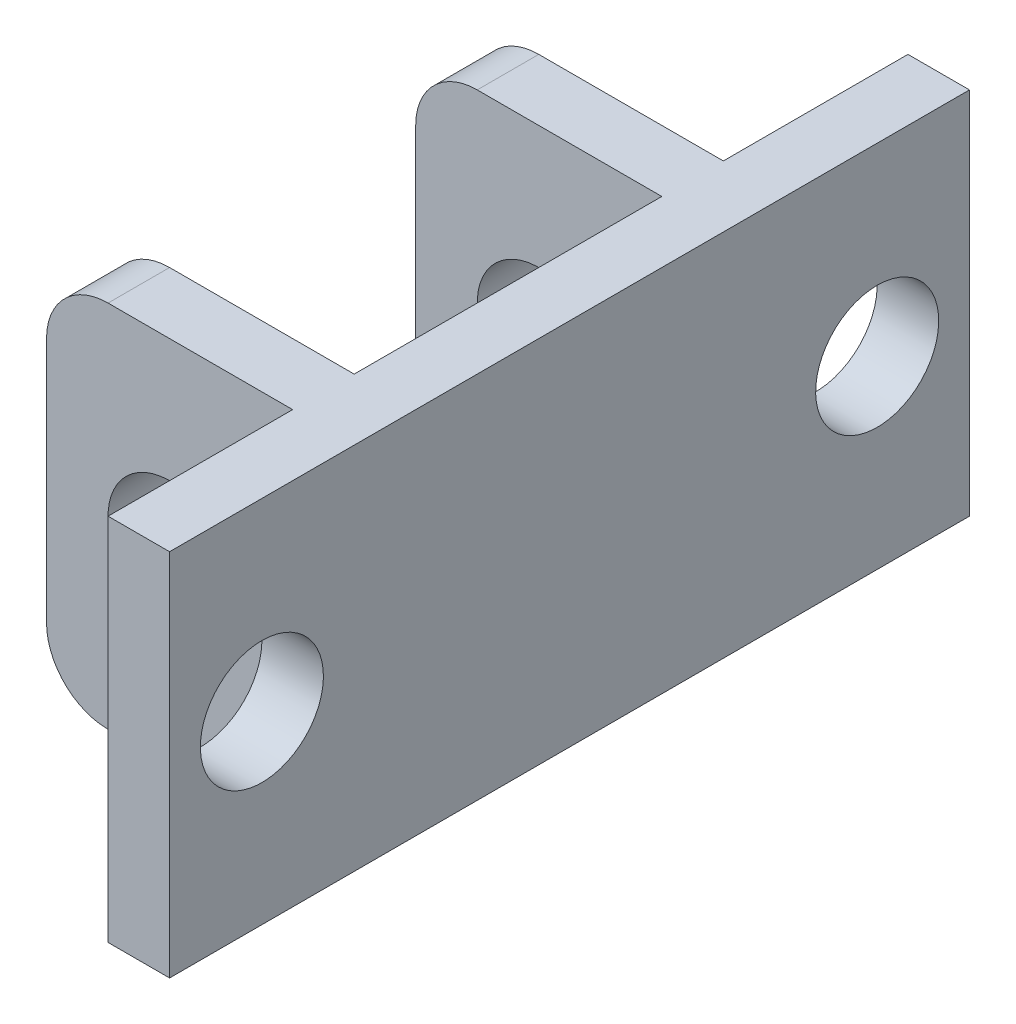
ISO-10303-21;
HEADER;
FILE_DESCRIPTION(('STEP AP214'),'2;1');
FILE_NAME('part.step','',(''),(''),'','','');
FILE_SCHEMA(('AUTOMOTIVE_DESIGN { 1 0 10303 214 1 1 1 1 }'));
ENDSEC;
DATA;
#1=APPLICATION_CONTEXT('core data for automotive mechanical design processes');
#2=APPLICATION_PROTOCOL_DEFINITION('international standard','automotive_design',2000,#1);
#3=PRODUCT_CONTEXT('',#1,'mechanical');
#4=PRODUCT('Part','Part','',(#3));
#5=PRODUCT_RELATED_PRODUCT_CATEGORY('part','',(#4));
#6=PRODUCT_DEFINITION_FORMATION('','',#4);
#7=PRODUCT_DEFINITION_CONTEXT('part definition',#1,'design');
#8=PRODUCT_DEFINITION('design','',#6,#7);
#9=PRODUCT_DEFINITION_SHAPE('','',#8);
#10=(LENGTH_UNIT() NAMED_UNIT(*) SI_UNIT(.MILLI.,.METRE.));
#11=(NAMED_UNIT(*) PLANE_ANGLE_UNIT() SI_UNIT($,.RADIAN.));
#12=(NAMED_UNIT(*) SI_UNIT($,.STERADIAN.) SOLID_ANGLE_UNIT());
#13=UNCERTAINTY_MEASURE_WITH_UNIT(LENGTH_MEASURE(1.E-05),#10,'distance_accuracy_value','');
#14=(GEOMETRIC_REPRESENTATION_CONTEXT(3) GLOBAL_UNCERTAINTY_ASSIGNED_CONTEXT((#13)) GLOBAL_UNIT_ASSIGNED_CONTEXT((#10,
#11,#12)) REPRESENTATION_CONTEXT('',''));
#15=CARTESIAN_POINT('',(0.,0.,0.));
#16=DIRECTION('',(0.,0.,1.));
#17=DIRECTION('',(1.,0.,0.));
#18=AXIS2_PLACEMENT_3D('',#15,#16,#17);
#19=CARTESIAN_POINT('',(0.,0.,1.));
#20=DIRECTION('',(0.,0.,1.));
#21=DIRECTION('',(1.,0.,0.));
#22=AXIS2_PLACEMENT_3D('',#19,#20,#21);
#23=PLANE('',#22);
#24=DIRECTION('',(0.,-1.,0.));
#25=VECTOR('',#24,1.);
#26=CARTESIAN_POINT('',(-2.,3.,1.));
#27=LINE('',#26,#25);
#28=CARTESIAN_POINT('',(-2.,2.,1.));
#29=VERTEX_POINT('',#28);
#30=CARTESIAN_POINT('',(-2.,-2.,1.));
#31=VERTEX_POINT('',#30);
#32=EDGE_CURVE('E267',#29,#31,#27,.T.);
#33=ORIENTED_EDGE('',*,*,#32,.T.);
#34=CARTESIAN_POINT('',(-1.,-2.,1.));
#35=DIRECTION('',(0.,0.,1.));
#36=DIRECTION('',(1.,0.,0.));
#37=AXIS2_PLACEMENT_3D('',#34,#35,#36);
#38=CIRCLE('',#37,1.);
#39=CARTESIAN_POINT('',(-1.,-3.,1.));
#40=VERTEX_POINT('',#39);
#41=EDGE_CURVE('E44',#31,#40,#38,.T.);
#42=ORIENTED_EDGE('',*,*,#41,.T.);
#43=DIRECTION('',(1.,0.,0.));
#44=VECTOR('',#43,1.);
#45=CARTESIAN_POINT('',(-2.,-3.,1.));
#46=LINE('',#45,#44);
#47=CARTESIAN_POINT('',(2.,-3.,1.));
#48=VERTEX_POINT('',#47);
#49=EDGE_CURVE('E269',#40,#48,#46,.T.);
#50=ORIENTED_EDGE('',*,*,#49,.T.);
#51=DIRECTION('',(0.,1.,0.));
#52=VECTOR('',#51,1.);
#53=CARTESIAN_POINT('',(2.,3.,1.));
#54=LINE('',#53,#52);
#55=CARTESIAN_POINT('',(2.,3.,1.));
#56=VERTEX_POINT('',#55);
#57=EDGE_CURVE('E261',#48,#56,#54,.T.);
#58=ORIENTED_EDGE('',*,*,#57,.T.);
#59=DIRECTION('',(-1.,0.,0.));
#60=VECTOR('',#59,1.);
#61=CARTESIAN_POINT('',(-2.,3.,1.));
#62=LINE('',#61,#60);
#63=CARTESIAN_POINT('',(-1.,3.,1.));
#64=VERTEX_POINT('',#63);
#65=EDGE_CURVE('E264',#56,#64,#62,.T.);
#66=ORIENTED_EDGE('',*,*,#65,.T.);
#67=CARTESIAN_POINT('',(-1.,2.,1.));
#68=DIRECTION('',(0.,0.,1.));
#69=DIRECTION('',(1.,0.,0.));
#70=AXIS2_PLACEMENT_3D('',#67,#68,#69);
#71=CIRCLE('',#70,1.);
#72=EDGE_CURVE('E288',#64,#29,#71,.T.);
#73=ORIENTED_EDGE('',*,*,#72,.T.);
#74=EDGE_LOOP('',(#33,#42,#50,#58,#66,#73));
#75=FACE_BOUND('',#74,.T.);
#76=CARTESIAN_POINT('',(0.,0.,1.));
#77=DIRECTION('',(0.,0.,1.));
#78=DIRECTION('',(1.,0.,0.));
#79=AXIS2_PLACEMENT_3D('',#76,#77,#78);
#80=CIRCLE('',#79,1.);
#81=CARTESIAN_POINT('',(1.,0.,1.));
#82=VERTEX_POINT('',#81);
#83=EDGE_CURVE('E255',#82,#82,#80,.T.);
#84=ORIENTED_EDGE('',*,*,#83,.F.);
#85=EDGE_LOOP('',(#84));
#86=FACE_BOUND('',#85,.T.);
#87=ADVANCED_FACE('F36',(#75,#86),#23,.T.);
#88=CARTESIAN_POINT('',(0.,0.,0.));
#89=DIRECTION('',(0.,0.,1.));
#90=DIRECTION('',(1.,0.,0.));
#91=AXIS2_PLACEMENT_3D('',#88,#89,#90);
#92=PLANE('',#91);
#93=DIRECTION('',(1.,0.,0.));
#94=VECTOR('',#93,1.);
#95=CARTESIAN_POINT('',(-2.,-3.,0.));
#96=LINE('',#95,#94);
#97=CARTESIAN_POINT('',(-1.,-3.,0.));
#98=VERTEX_POINT('',#97);
#99=CARTESIAN_POINT('',(2.,-3.,0.));
#100=VERTEX_POINT('',#99);
#101=EDGE_CURVE('E265',#98,#100,#96,.T.);
#102=ORIENTED_EDGE('',*,*,#101,.F.);
#103=CARTESIAN_POINT('',(-1.,-2.,0.));
#104=DIRECTION('',(0.,0.,1.));
#105=DIRECTION('',(1.,0.,0.));
#106=AXIS2_PLACEMENT_3D('',#103,#104,#105);
#107=CIRCLE('',#106,1.);
#108=CARTESIAN_POINT('',(-2.,-2.,0.));
#109=VERTEX_POINT('',#108);
#110=EDGE_CURVE('E282',#98,#109,#107,.F.);
#111=ORIENTED_EDGE('',*,*,#110,.T.);
#112=DIRECTION('',(0.,-1.,0.));
#113=VECTOR('',#112,1.);
#114=CARTESIAN_POINT('',(-2.,3.,0.));
#115=LINE('',#114,#113);
#116=CARTESIAN_POINT('',(-2.,2.,0.));
#117=VERTEX_POINT('',#116);
#118=EDGE_CURVE('E275',#117,#109,#115,.T.);
#119=ORIENTED_EDGE('',*,*,#118,.F.);
#120=CARTESIAN_POINT('',(-1.,2.,0.));
#121=DIRECTION('',(0.,0.,1.));
#122=DIRECTION('',(1.,0.,0.));
#123=AXIS2_PLACEMENT_3D('',#120,#121,#122);
#124=CIRCLE('',#123,1.);
#125=CARTESIAN_POINT('',(-1.,3.,0.));
#126=VERTEX_POINT('',#125);
#127=EDGE_CURVE('E280',#117,#126,#124,.F.);
#128=ORIENTED_EDGE('',*,*,#127,.T.);
#129=DIRECTION('',(-1.,0.,0.));
#130=VECTOR('',#129,1.);
#131=CARTESIAN_POINT('',(-2.,3.,0.));
#132=LINE('',#131,#130);
#133=CARTESIAN_POINT('',(2.,3.,0.));
#134=VERTEX_POINT('',#133);
#135=EDGE_CURVE('E273',#134,#126,#132,.T.);
#136=ORIENTED_EDGE('',*,*,#135,.F.);
#137=DIRECTION('',(0.,1.,0.));
#138=VECTOR('',#137,1.);
#139=CARTESIAN_POINT('',(2.,3.,0.));
#140=LINE('',#139,#138);
#141=EDGE_CURVE('E258',#100,#134,#140,.T.);
#142=ORIENTED_EDGE('',*,*,#141,.F.);
#143=EDGE_LOOP('',(#102,#111,#119,#128,#136,#142));
#144=FACE_BOUND('',#143,.T.);
#145=CARTESIAN_POINT('',(0.,0.,0.));
#146=DIRECTION('',(0.,0.,1.));
#147=DIRECTION('',(1.,0.,0.));
#148=AXIS2_PLACEMENT_3D('',#145,#146,#147);
#149=CIRCLE('',#148,1.);
#150=CARTESIAN_POINT('',(1.,0.,0.));
#151=VERTEX_POINT('',#150);
#152=EDGE_CURVE('E254',#151,#151,#149,.T.);
#153=ORIENTED_EDGE('',*,*,#152,.T.);
#154=EDGE_LOOP('',(#153));
#155=FACE_BOUND('',#154,.T.);
#156=ADVANCED_FACE('F299',(#144,#155),#92,.F.);
#157=CARTESIAN_POINT('',(-2.,3.,1.));
#158=DIRECTION('',(0.,-1.,0.));
#159=DIRECTION('',(0.,0.,-1.));
#160=AXIS2_PLACEMENT_3D('',#157,#158,#159);
#161=PLANE('',#160);
#162=ORIENTED_EDGE('',*,*,#135,.T.);
#163=DIRECTION('',(0.,0.,-1.));
#164=VECTOR('',#163,1.);
#165=CARTESIAN_POINT('',(-1.,3.,1.));
#166=LINE('',#165,#164);
#167=EDGE_CURVE('E11',#126,#64,#166,.F.);
#168=ORIENTED_EDGE('',*,*,#167,.T.);
#169=ORIENTED_EDGE('',*,*,#65,.F.);
#170=DIRECTION('',(0.,0.,-1.));
#171=VECTOR('',#170,1.);
#172=CARTESIAN_POINT('',(2.,3.,0.));
#173=LINE('',#172,#171);
#174=CARTESIAN_POINT('',(2.,3.,4.));
#175=VERTEX_POINT('',#174);
#176=EDGE_CURVE('E236',#175,#56,#173,.T.);
#177=ORIENTED_EDGE('',*,*,#176,.F.);
#178=DIRECTION('',(-1.,0.,0.));
#179=VECTOR('',#178,1.);
#180=CARTESIAN_POINT('',(3.,3.,4.));
#181=LINE('',#180,#179);
#182=CARTESIAN_POINT('',(3.,3.,4.));
#183=VERTEX_POINT('',#182);
#184=EDGE_CURVE('E239',#183,#175,#181,.T.);
#185=ORIENTED_EDGE('',*,*,#184,.F.);
#186=DIRECTION('',(0.,0.,-1.));
#187=VECTOR('',#186,1.);
#188=CARTESIAN_POINT('',(3.,3.,0.));
#189=LINE('',#188,#187);
#190=CARTESIAN_POINT('',(3.,3.,-9.));
#191=VERTEX_POINT('',#190);
#192=EDGE_CURVE('E164',#183,#191,#189,.T.);
#193=ORIENTED_EDGE('',*,*,#192,.T.);
#194=DIRECTION('',(-1.,0.,0.));
#195=VECTOR('',#194,1.);
#196=CARTESIAN_POINT('',(3.,3.,-9.));
#197=LINE('',#196,#195);
#198=CARTESIAN_POINT('',(2.,3.,-9.));
#199=VERTEX_POINT('',#198);
#200=EDGE_CURVE('E172',#191,#199,#197,.T.);
#201=ORIENTED_EDGE('',*,*,#200,.T.);
#202=DIRECTION('',(0.,0.,1.));
#203=VECTOR('',#202,1.);
#204=CARTESIAN_POINT('',(2.,3.,-5.));
#205=LINE('',#204,#203);
#206=CARTESIAN_POINT('',(2.,3.,-6.));
#207=VERTEX_POINT('',#206);
#208=EDGE_CURVE('E336',#199,#207,#205,.T.);
#209=ORIENTED_EDGE('',*,*,#208,.T.);
#210=DIRECTION('',(-1.,0.,0.));
#211=VECTOR('',#210,1.);
#212=CARTESIAN_POINT('',(-2.,3.,-6.));
#213=LINE('',#212,#211);
#214=CARTESIAN_POINT('',(-1.,3.,-6.));
#215=VERTEX_POINT('',#214);
#216=EDGE_CURVE('E193',#207,#215,#213,.T.);
#217=ORIENTED_EDGE('',*,*,#216,.T.);
#218=DIRECTION('',(0.,0.,1.));
#219=VECTOR('',#218,1.);
#220=CARTESIAN_POINT('',(-1.,3.,-6.));
#221=LINE('',#220,#219);
#222=CARTESIAN_POINT('',(-1.,3.,-5.));
#223=VERTEX_POINT('',#222);
#224=EDGE_CURVE('E230',#223,#215,#221,.F.);
#225=ORIENTED_EDGE('',*,*,#224,.F.);
#226=DIRECTION('',(-1.,0.,0.));
#227=VECTOR('',#226,1.);
#228=CARTESIAN_POINT('',(-2.,3.,-5.));
#229=LINE('',#228,#227);
#230=CARTESIAN_POINT('',(2.,3.,-5.));
#231=VERTEX_POINT('',#230);
#232=EDGE_CURVE('E205',#231,#223,#229,.T.);
#233=ORIENTED_EDGE('',*,*,#232,.F.);
#234=EDGE_CURVE('E249',#134,#231,#173,.T.);
#235=ORIENTED_EDGE('',*,*,#234,.F.);
#236=EDGE_LOOP('',(#162,#168,#169,#177,#185,#193,#201,#209,#217,#225,#233,#235));
#237=FACE_BOUND('',#236,.T.);
#238=ADVANCED_FACE('F308',(#237),#161,.F.);
#239=CARTESIAN_POINT('',(-2.,3.,1.));
#240=DIRECTION('',(1.,0.,0.));
#241=DIRECTION('',(0.,1.,0.));
#242=AXIS2_PLACEMENT_3D('',#239,#240,#241);
#243=PLANE('',#242);
#244=ORIENTED_EDGE('',*,*,#118,.T.);
#245=DIRECTION('',(0.,0.,-1.));
#246=VECTOR('',#245,1.);
#247=CARTESIAN_POINT('',(-2.,-2.,1.));
#248=LINE('',#247,#246);
#249=EDGE_CURVE('E57',#109,#31,#248,.F.);
#250=ORIENTED_EDGE('',*,*,#249,.T.);
#251=ORIENTED_EDGE('',*,*,#32,.F.);
#252=DIRECTION('',(0.,0.,-1.));
#253=VECTOR('',#252,1.);
#254=CARTESIAN_POINT('',(-2.,2.,1.));
#255=LINE('',#254,#253);
#256=EDGE_CURVE('E284',#29,#117,#255,.T.);
#257=ORIENTED_EDGE('',*,*,#256,.T.);
#258=EDGE_LOOP('',(#244,#250,#251,#257));
#259=FACE_BOUND('',#258,.T.);
#260=ADVANCED_FACE('F302',(#259),#243,.F.);
#261=CARTESIAN_POINT('',(-2.,-3.,1.));
#262=DIRECTION('',(0.,1.,0.));
#263=DIRECTION('',(0.,0.,1.));
#264=AXIS2_PLACEMENT_3D('',#261,#262,#263);
#265=PLANE('',#264);
#266=ORIENTED_EDGE('',*,*,#49,.F.);
#267=DIRECTION('',(0.,0.,-1.));
#268=VECTOR('',#267,1.);
#269=CARTESIAN_POINT('',(-1.,-3.,1.));
#270=LINE('',#269,#268);
#271=EDGE_CURVE('E271',#40,#98,#270,.T.);
#272=ORIENTED_EDGE('',*,*,#271,.T.);
#273=ORIENTED_EDGE('',*,*,#101,.T.);
#274=DIRECTION('',(0.,0.,-1.));
#275=VECTOR('',#274,1.);
#276=CARTESIAN_POINT('',(2.,-3.,0.));
#277=LINE('',#276,#275);
#278=CARTESIAN_POINT('',(2.,-3.,-5.));
#279=VERTEX_POINT('',#278);
#280=EDGE_CURVE('E245',#100,#279,#277,.T.);
#281=ORIENTED_EDGE('',*,*,#280,.T.);
#282=DIRECTION('',(1.,0.,0.));
#283=VECTOR('',#282,1.);
#284=CARTESIAN_POINT('',(-2.,-3.,-5.));
#285=LINE('',#284,#283);
#286=CARTESIAN_POINT('',(-1.,-3.,-5.));
#287=VERTEX_POINT('',#286);
#288=EDGE_CURVE('E194',#287,#279,#285,.T.);
#289=ORIENTED_EDGE('',*,*,#288,.F.);
#290=DIRECTION('',(0.,0.,1.));
#291=VECTOR('',#290,1.);
#292=CARTESIAN_POINT('',(-1.,-3.,-6.));
#293=LINE('',#292,#291);
#294=CARTESIAN_POINT('',(-1.,-3.,-6.));
#295=VERTEX_POINT('',#294);
#296=EDGE_CURVE('E202',#295,#287,#293,.T.);
#297=ORIENTED_EDGE('',*,*,#296,.F.);
#298=DIRECTION('',(1.,0.,0.));
#299=VECTOR('',#298,1.);
#300=CARTESIAN_POINT('',(-2.,-3.,-6.));
#301=LINE('',#300,#299);
#302=CARTESIAN_POINT('',(2.,-3.,-6.));
#303=VERTEX_POINT('',#302);
#304=EDGE_CURVE('E200',#295,#303,#301,.T.);
#305=ORIENTED_EDGE('',*,*,#304,.T.);
#306=DIRECTION('',(0.,0.,1.));
#307=VECTOR('',#306,1.);
#308=CARTESIAN_POINT('',(2.,-3.,-5.));
#309=LINE('',#308,#307);
#310=CARTESIAN_POINT('',(2.,-3.,-9.));
#311=VERTEX_POINT('',#310);
#312=EDGE_CURVE('E178',#311,#303,#309,.T.);
#313=ORIENTED_EDGE('',*,*,#312,.F.);
#314=DIRECTION('',(-1.,0.,0.));
#315=VECTOR('',#314,1.);
#316=CARTESIAN_POINT('',(3.,-3.,-9.));
#317=LINE('',#316,#315);
#318=CARTESIAN_POINT('',(3.,-3.,-9.));
#319=VERTEX_POINT('',#318);
#320=EDGE_CURVE('E169',#319,#311,#317,.T.);
#321=ORIENTED_EDGE('',*,*,#320,.F.);
#322=DIRECTION('',(0.,0.,-1.));
#323=VECTOR('',#322,1.);
#324=CARTESIAN_POINT('',(3.,-3.,0.));
#325=LINE('',#324,#323);
#326=CARTESIAN_POINT('',(3.,-3.,4.));
#327=VERTEX_POINT('',#326);
#328=EDGE_CURVE('E151',#327,#319,#325,.T.);
#329=ORIENTED_EDGE('',*,*,#328,.F.);
#330=DIRECTION('',(-1.,0.,0.));
#331=VECTOR('',#330,1.);
#332=CARTESIAN_POINT('',(3.,-3.,4.));
#333=LINE('',#332,#331);
#334=CARTESIAN_POINT('',(2.,-3.,4.));
#335=VERTEX_POINT('',#334);
#336=EDGE_CURVE('E252',#327,#335,#333,.T.);
#337=ORIENTED_EDGE('',*,*,#336,.T.);
#338=EDGE_CURVE('E246',#335,#48,#277,.T.);
#339=ORIENTED_EDGE('',*,*,#338,.T.);
#340=EDGE_LOOP('',(#266,#272,#273,#281,#289,#297,#305,#313,#321,#329,#337,#339));
#341=FACE_BOUND('',#340,.T.);
#342=ADVANCED_FACE('F176',(#341),#265,.F.);
#343=CARTESIAN_POINT('',(0.,0.,1.));
#344=DIRECTION('',(0.,0.,-1.));
#345=DIRECTION('',(-1.,0.,0.));
#346=AXIS2_PLACEMENT_3D('',#343,#344,#345);
#347=CYLINDRICAL_SURFACE('',#346,1.);
#348=ORIENTED_EDGE('',*,*,#83,.T.);
#349=EDGE_LOOP('',(#348));
#350=FACE_BOUND('',#349,.T.);
#351=ORIENTED_EDGE('',*,*,#152,.F.);
#352=EDGE_LOOP('',(#351));
#353=FACE_BOUND('',#352,.T.);
#354=ADVANCED_FACE('F367',(#350,#353),#347,.F.);
#355=CARTESIAN_POINT('',(2.,0.,0.));
#356=DIRECTION('',(1.,0.,0.));
#357=DIRECTION('',(0.,1.,0.));
#358=AXIS2_PLACEMENT_3D('',#355,#356,#357);
#359=PLANE('',#358);
#360=ORIENTED_EDGE('',*,*,#280,.F.);
#361=ORIENTED_EDGE('',*,*,#141,.T.);
#362=ORIENTED_EDGE('',*,*,#234,.T.);
#363=DIRECTION('',(0.,1.,0.));
#364=VECTOR('',#363,1.);
#365=CARTESIAN_POINT('',(2.,3.,-5.));
#366=LINE('',#365,#364);
#367=EDGE_CURVE('E188',#279,#231,#366,.T.);
#368=ORIENTED_EDGE('',*,*,#367,.F.);
#369=EDGE_LOOP('',(#360,#361,#362,#368));
#370=FACE_BOUND('',#369,.T.);
#371=ADVANCED_FACE('F313',(#370),#359,.F.);
#372=CARTESIAN_POINT('',(3.,0.,4.));
#373=DIRECTION('',(0.,0.,-1.));
#374=DIRECTION('',(0.,1.,0.));
#375=AXIS2_PLACEMENT_3D('',#372,#373,#374);
#376=PLANE('',#375);
#377=DIRECTION('',(0.,-1.,0.));
#378=VECTOR('',#377,1.);
#379=CARTESIAN_POINT('',(2.,0.,4.));
#380=LINE('',#379,#378);
#381=EDGE_CURVE('E242',#175,#335,#380,.T.);
#382=ORIENTED_EDGE('',*,*,#381,.T.);
#383=ORIENTED_EDGE('',*,*,#336,.F.);
#384=DIRECTION('',(0.,-1.,0.));
#385=VECTOR('',#384,1.);
#386=CARTESIAN_POINT('',(3.,0.,4.));
#387=LINE('',#386,#385);
#388=EDGE_CURVE('E159',#183,#327,#387,.T.);
#389=ORIENTED_EDGE('',*,*,#388,.F.);
#390=ORIENTED_EDGE('',*,*,#184,.T.);
#391=EDGE_LOOP('',(#382,#383,#389,#390));
#392=FACE_BOUND('',#391,.T.);
#393=ADVANCED_FACE('F392',(#392),#376,.F.);
#394=CARTESIAN_POINT('',(3.,0.,2.5));
#395=DIRECTION('',(-1.,0.,0.));
#396=DIRECTION('',(0.,-1.,0.));
#397=AXIS2_PLACEMENT_3D('',#394,#395,#396);
#398=CYLINDRICAL_SURFACE('',#397,1.);
#399=CARTESIAN_POINT('',(3.,0.,2.5));
#400=DIRECTION('',(1.,0.,0.));
#401=DIRECTION('',(0.,1.,0.));
#402=AXIS2_PLACEMENT_3D('',#399,#400,#401);
#403=CIRCLE('',#402,1.);
#404=CARTESIAN_POINT('',(3.,1.,2.5));
#405=VERTEX_POINT('',#404);
#406=EDGE_CURVE('E233',#405,#405,#403,.T.);
#407=ORIENTED_EDGE('',*,*,#406,.T.);
#408=EDGE_LOOP('',(#407));
#409=FACE_BOUND('',#408,.T.);
#410=CARTESIAN_POINT('',(2.,0.,2.5));
#411=DIRECTION('',(1.,0.,0.));
#412=DIRECTION('',(0.,1.,0.));
#413=AXIS2_PLACEMENT_3D('',#410,#411,#412);
#414=CIRCLE('',#413,1.);
#415=CARTESIAN_POINT('',(2.,1.,2.5));
#416=VERTEX_POINT('',#415);
#417=EDGE_CURVE('E232',#416,#416,#414,.T.);
#418=ORIENTED_EDGE('',*,*,#417,.F.);
#419=EDGE_LOOP('',(#418));
#420=FACE_BOUND('',#419,.T.);
#421=ADVANCED_FACE('F386',(#409,#420),#398,.F.);
#422=CARTESIAN_POINT('',(3.,0.,0.));
#423=DIRECTION('',(1.,0.,0.));
#424=DIRECTION('',(0.,1.,0.));
#425=AXIS2_PLACEMENT_3D('',#422,#423,#424);
#426=PLANE('',#425);
#427=ORIENTED_EDGE('',*,*,#406,.F.);
#428=EDGE_LOOP('',(#427));
#429=FACE_BOUND('',#428,.T.);
#430=ORIENTED_EDGE('',*,*,#388,.T.);
#431=ORIENTED_EDGE('',*,*,#328,.T.);
#432=DIRECTION('',(0.,-1.,0.));
#433=VECTOR('',#432,1.);
#434=CARTESIAN_POINT('',(3.,0.,-9.));
#435=LINE('',#434,#433);
#436=EDGE_CURVE('E156',#191,#319,#435,.T.);
#437=ORIENTED_EDGE('',*,*,#436,.F.);
#438=ORIENTED_EDGE('',*,*,#192,.F.);
#439=EDGE_LOOP('',(#430,#431,#437,#438));
#440=FACE_BOUND('',#439,.T.);
#441=CARTESIAN_POINT('',(3.,0.,-7.5));
#442=DIRECTION('',(-1.,0.,0.));
#443=DIRECTION('',(0.,1.,0.));
#444=AXIS2_PLACEMENT_3D('',#441,#442,#443);
#445=CIRCLE('',#444,1.);
#446=CARTESIAN_POINT('',(3.,1.,-7.5));
#447=VERTEX_POINT('',#446);
#448=EDGE_CURVE('E173',#447,#447,#445,.T.);
#449=ORIENTED_EDGE('',*,*,#448,.T.);
#450=EDGE_LOOP('',(#449));
#451=FACE_BOUND('',#450,.T.);
#452=ADVANCED_FACE('F153',(#429,#440,#451),#426,.T.);
#453=ORIENTED_EDGE('',*,*,#57,.F.);
#454=ORIENTED_EDGE('',*,*,#338,.F.);
#455=ORIENTED_EDGE('',*,*,#381,.F.);
#456=ORIENTED_EDGE('',*,*,#176,.T.);
#457=EDGE_LOOP('',(#453,#454,#455,#456));
#458=FACE_BOUND('',#457,.T.);
#459=ORIENTED_EDGE('',*,*,#417,.T.);
#460=EDGE_LOOP('',(#459));
#461=FACE_BOUND('',#460,.T.);
#462=ADVANCED_FACE('F376',(#458,#461),#359,.F.);
#463=CARTESIAN_POINT('',(-1.,-2.,1.));
#464=DIRECTION('',(0.,0.,-1.));
#465=DIRECTION('',(-1.,0.,0.));
#466=AXIS2_PLACEMENT_3D('',#463,#464,#465);
#467=CYLINDRICAL_SURFACE('',#466,1.);
#468=ORIENTED_EDGE('',*,*,#41,.F.);
#469=ORIENTED_EDGE('',*,*,#249,.F.);
#470=ORIENTED_EDGE('',*,*,#110,.F.);
#471=ORIENTED_EDGE('',*,*,#271,.F.);
#472=EDGE_LOOP('',(#468,#469,#470,#471));
#473=FACE_BOUND('',#472,.T.);
#474=ADVANCED_FACE('F296',(#473),#467,.T.);
#475=CARTESIAN_POINT('',(-1.,2.,1.));
#476=DIRECTION('',(0.,0.,-1.));
#477=DIRECTION('',(-1.,0.,0.));
#478=AXIS2_PLACEMENT_3D('',#475,#476,#477);
#479=CYLINDRICAL_SURFACE('',#478,1.);
#480=ORIENTED_EDGE('',*,*,#72,.F.);
#481=ORIENTED_EDGE('',*,*,#167,.F.);
#482=ORIENTED_EDGE('',*,*,#127,.F.);
#483=ORIENTED_EDGE('',*,*,#256,.F.);
#484=EDGE_LOOP('',(#480,#481,#482,#483));
#485=FACE_BOUND('',#484,.T.);
#486=ADVANCED_FACE('F38',(#485),#479,.T.);
#487=CARTESIAN_POINT('',(0.,0.,-6.));
#488=DIRECTION('',(0.,0.,-1.));
#489=DIRECTION('',(1.,0.,0.));
#490=AXIS2_PLACEMENT_3D('',#487,#488,#489);
#491=PLANE('',#490);
#492=DIRECTION('',(0.,-1.,0.));
#493=VECTOR('',#492,1.);
#494=CARTESIAN_POINT('',(-2.,3.,-6.));
#495=LINE('',#494,#493);
#496=CARTESIAN_POINT('',(-2.,2.,-6.));
#497=VERTEX_POINT('',#496);
#498=CARTESIAN_POINT('',(-2.,-2.,-6.));
#499=VERTEX_POINT('',#498);
#500=EDGE_CURVE('E197',#497,#499,#495,.T.);
#501=ORIENTED_EDGE('',*,*,#500,.F.);
#502=CARTESIAN_POINT('',(-1.,2.,-6.));
#503=DIRECTION('',(0.,0.,1.));
#504=DIRECTION('',(1.,0.,0.));
#505=AXIS2_PLACEMENT_3D('',#502,#503,#504);
#506=CIRCLE('',#505,1.);
#507=EDGE_CURVE('E224',#215,#497,#506,.T.);
#508=ORIENTED_EDGE('',*,*,#507,.F.);
#509=ORIENTED_EDGE('',*,*,#216,.F.);
#510=DIRECTION('',(0.,1.,0.));
#511=VECTOR('',#510,1.);
#512=CARTESIAN_POINT('',(2.,3.,-6.));
#513=LINE('',#512,#511);
#514=EDGE_CURVE('E190',#303,#207,#513,.T.);
#515=ORIENTED_EDGE('',*,*,#514,.F.);
#516=ORIENTED_EDGE('',*,*,#304,.F.);
#517=CARTESIAN_POINT('',(-1.,-2.,-6.));
#518=DIRECTION('',(0.,0.,1.));
#519=DIRECTION('',(1.,0.,0.));
#520=AXIS2_PLACEMENT_3D('',#517,#518,#519);
#521=CIRCLE('',#520,1.);
#522=EDGE_CURVE('E227',#499,#295,#521,.T.);
#523=ORIENTED_EDGE('',*,*,#522,.F.);
#524=EDGE_LOOP('',(#501,#508,#509,#515,#516,#523));
#525=FACE_BOUND('',#524,.T.);
#526=CARTESIAN_POINT('',(0.,0.,-6.));
#527=DIRECTION('',(0.,0.,1.));
#528=DIRECTION('',(1.,0.,0.));
#529=AXIS2_PLACEMENT_3D('',#526,#527,#528);
#530=CIRCLE('',#529,1.);
#531=CARTESIAN_POINT('',(1.,0.,-6.));
#532=VERTEX_POINT('',#531);
#533=EDGE_CURVE('E182',#532,#532,#530,.T.);
#534=ORIENTED_EDGE('',*,*,#533,.T.);
#535=EDGE_LOOP('',(#534));
#536=FACE_BOUND('',#535,.T.);
#537=ADVANCED_FACE('F328',(#525,#536),#491,.T.);
#538=CARTESIAN_POINT('',(0.,0.,-5.));
#539=DIRECTION('',(0.,0.,-1.));
#540=DIRECTION('',(1.,0.,0.));
#541=AXIS2_PLACEMENT_3D('',#538,#539,#540);
#542=PLANE('',#541);
#543=ORIENTED_EDGE('',*,*,#288,.T.);
#544=ORIENTED_EDGE('',*,*,#367,.T.);
#545=ORIENTED_EDGE('',*,*,#232,.T.);
#546=CARTESIAN_POINT('',(-1.,2.,-5.));
#547=DIRECTION('',(0.,0.,1.));
#548=DIRECTION('',(1.,0.,0.));
#549=AXIS2_PLACEMENT_3D('',#546,#547,#548);
#550=CIRCLE('',#549,1.);
#551=CARTESIAN_POINT('',(-2.,2.,-5.));
#552=VERTEX_POINT('',#551);
#553=EDGE_CURVE('E214',#552,#223,#550,.F.);
#554=ORIENTED_EDGE('',*,*,#553,.F.);
#555=DIRECTION('',(0.,-1.,0.));
#556=VECTOR('',#555,1.);
#557=CARTESIAN_POINT('',(-2.,3.,-5.));
#558=LINE('',#557,#556);
#559=CARTESIAN_POINT('',(-2.,-2.,-5.));
#560=VERTEX_POINT('',#559);
#561=EDGE_CURVE('E208',#552,#560,#558,.T.);
#562=ORIENTED_EDGE('',*,*,#561,.T.);
#563=CARTESIAN_POINT('',(-1.,-2.,-5.));
#564=DIRECTION('',(0.,0.,1.));
#565=DIRECTION('',(1.,0.,0.));
#566=AXIS2_PLACEMENT_3D('',#563,#564,#565);
#567=CIRCLE('',#566,1.);
#568=EDGE_CURVE('E217',#287,#560,#567,.F.);
#569=ORIENTED_EDGE('',*,*,#568,.F.);
#570=EDGE_LOOP('',(#543,#544,#545,#554,#562,#569));
#571=FACE_BOUND('',#570,.T.);
#572=CARTESIAN_POINT('',(0.,0.,-5.));
#573=DIRECTION('',(0.,0.,1.));
#574=DIRECTION('',(1.,0.,0.));
#575=AXIS2_PLACEMENT_3D('',#572,#573,#574);
#576=CIRCLE('',#575,1.);
#577=CARTESIAN_POINT('',(1.,0.,-5.));
#578=VERTEX_POINT('',#577);
#579=EDGE_CURVE('E179',#578,#578,#576,.T.);
#580=ORIENTED_EDGE('',*,*,#579,.F.);
#581=EDGE_LOOP('',(#580));
#582=FACE_BOUND('',#581,.T.);
#583=ADVANCED_FACE('F317',(#571,#582),#542,.F.);
#584=CARTESIAN_POINT('',(-2.,3.,-6.));
#585=DIRECTION('',(1.,0.,0.));
#586=DIRECTION('',(0.,1.,0.));
#587=AXIS2_PLACEMENT_3D('',#584,#585,#586);
#588=PLANE('',#587);
#589=ORIENTED_EDGE('',*,*,#561,.F.);
#590=DIRECTION('',(0.,0.,1.));
#591=VECTOR('',#590,1.);
#592=CARTESIAN_POINT('',(-2.,2.,-6.));
#593=LINE('',#592,#591);
#594=EDGE_CURVE('E220',#497,#552,#593,.T.);
#595=ORIENTED_EDGE('',*,*,#594,.F.);
#596=ORIENTED_EDGE('',*,*,#500,.T.);
#597=DIRECTION('',(0.,0.,1.));
#598=VECTOR('',#597,1.);
#599=CARTESIAN_POINT('',(-2.,-2.,-6.));
#600=LINE('',#599,#598);
#601=EDGE_CURVE('E222',#560,#499,#600,.F.);
#602=ORIENTED_EDGE('',*,*,#601,.F.);
#603=EDGE_LOOP('',(#589,#595,#596,#602));
#604=FACE_BOUND('',#603,.T.);
#605=ADVANCED_FACE('F515',(#604),#588,.F.);
#606=CARTESIAN_POINT('',(0.,0.,-6.));
#607=DIRECTION('',(0.,0.,1.));
#608=DIRECTION('',(-1.,0.,0.));
#609=AXIS2_PLACEMENT_3D('',#606,#607,#608);
#610=CYLINDRICAL_SURFACE('',#609,1.);
#611=ORIENTED_EDGE('',*,*,#533,.F.);
#612=EDGE_LOOP('',(#611));
#613=FACE_BOUND('',#612,.T.);
#614=ORIENTED_EDGE('',*,*,#579,.T.);
#615=EDGE_LOOP('',(#614));
#616=FACE_BOUND('',#615,.T.);
#617=ADVANCED_FACE('F524',(#613,#616),#610,.F.);
#618=CARTESIAN_POINT('',(3.,0.,-9.));
#619=DIRECTION('',(0.,0.,1.));
#620=DIRECTION('',(0.,1.,0.));
#621=AXIS2_PLACEMENT_3D('',#618,#619,#620);
#622=PLANE('',#621);
#623=DIRECTION('',(0.,-1.,0.));
#624=VECTOR('',#623,1.);
#625=CARTESIAN_POINT('',(2.,0.,-9.));
#626=LINE('',#625,#624);
#627=EDGE_CURVE('E337',#199,#311,#626,.T.);
#628=ORIENTED_EDGE('',*,*,#627,.F.);
#629=ORIENTED_EDGE('',*,*,#200,.F.);
#630=ORIENTED_EDGE('',*,*,#436,.T.);
#631=ORIENTED_EDGE('',*,*,#320,.T.);
#632=EDGE_LOOP('',(#628,#629,#630,#631));
#633=FACE_BOUND('',#632,.T.);
#634=ADVANCED_FACE('F168',(#633),#622,.F.);
#635=CARTESIAN_POINT('',(3.,0.,-7.5));
#636=DIRECTION('',(-1.,0.,0.));
#637=DIRECTION('',(0.,-1.,0.));
#638=AXIS2_PLACEMENT_3D('',#635,#636,#637);
#639=CYLINDRICAL_SURFACE('',#638,1.);
#640=ORIENTED_EDGE('',*,*,#448,.F.);
#641=EDGE_LOOP('',(#640));
#642=FACE_BOUND('',#641,.T.);
#643=CARTESIAN_POINT('',(2.,0.,-7.5));
#644=DIRECTION('',(-1.,0.,0.));
#645=DIRECTION('',(0.,1.,0.));
#646=AXIS2_PLACEMENT_3D('',#643,#644,#645);
#647=CIRCLE('',#646,1.);
#648=CARTESIAN_POINT('',(2.,1.,-7.5));
#649=VERTEX_POINT('',#648);
#650=EDGE_CURVE('E339',#649,#649,#647,.T.);
#651=ORIENTED_EDGE('',*,*,#650,.T.);
#652=EDGE_LOOP('',(#651));
#653=FACE_BOUND('',#652,.T.);
#654=ADVANCED_FACE('F347',(#642,#653),#639,.F.);
#655=CARTESIAN_POINT('',(2.,0.,-5.));
#656=DIRECTION('',(1.,0.,0.));
#657=DIRECTION('',(0.,1.,0.));
#658=AXIS2_PLACEMENT_3D('',#655,#656,#657);
#659=PLANE('',#658);
#660=ORIENTED_EDGE('',*,*,#514,.T.);
#661=ORIENTED_EDGE('',*,*,#208,.F.);
#662=ORIENTED_EDGE('',*,*,#627,.T.);
#663=ORIENTED_EDGE('',*,*,#312,.T.);
#664=EDGE_LOOP('',(#660,#661,#662,#663));
#665=FACE_BOUND('',#664,.T.);
#666=ORIENTED_EDGE('',*,*,#650,.F.);
#667=EDGE_LOOP('',(#666));
#668=FACE_BOUND('',#667,.T.);
#669=ADVANCED_FACE('F334',(#665,#668),#659,.F.);
#670=CARTESIAN_POINT('',(-1.,-2.,-6.));
#671=DIRECTION('',(0.,0.,1.));
#672=DIRECTION('',(-1.,0.,0.));
#673=AXIS2_PLACEMENT_3D('',#670,#671,#672);
#674=CYLINDRICAL_SURFACE('',#673,1.);
#675=ORIENTED_EDGE('',*,*,#522,.T.);
#676=ORIENTED_EDGE('',*,*,#296,.T.);
#677=ORIENTED_EDGE('',*,*,#568,.T.);
#678=ORIENTED_EDGE('',*,*,#601,.T.);
#679=EDGE_LOOP('',(#675,#676,#677,#678));
#680=FACE_BOUND('',#679,.T.);
#681=ADVANCED_FACE('F322',(#680),#674,.T.);
#682=CARTESIAN_POINT('',(-1.,2.,-6.));
#683=DIRECTION('',(0.,0.,1.));
#684=DIRECTION('',(-1.,0.,0.));
#685=AXIS2_PLACEMENT_3D('',#682,#683,#684);
#686=CYLINDRICAL_SURFACE('',#685,1.);
#687=ORIENTED_EDGE('',*,*,#507,.T.);
#688=ORIENTED_EDGE('',*,*,#594,.T.);
#689=ORIENTED_EDGE('',*,*,#553,.T.);
#690=ORIENTED_EDGE('',*,*,#224,.T.);
#691=EDGE_LOOP('',(#687,#688,#689,#690));
#692=FACE_BOUND('',#691,.T.);
#693=ADVANCED_FACE('F357',(#692),#686,.T.);
#694=CLOSED_SHELL('',(#87,#156,#238,#260,#342,#354,#371,#393,#421,#452,#462,#474,#486,#537,#583,
#605,#617,#634,#654,#669,#681,#693));
#695=MANIFOLD_SOLID_BREP('B2',#694);
#696=ADVANCED_BREP_SHAPE_REPRESENTATION('',(#18,#695),#14);
#697=SHAPE_DEFINITION_REPRESENTATION(#9,#696);
ENDSEC;
END-ISO-10303-21;
